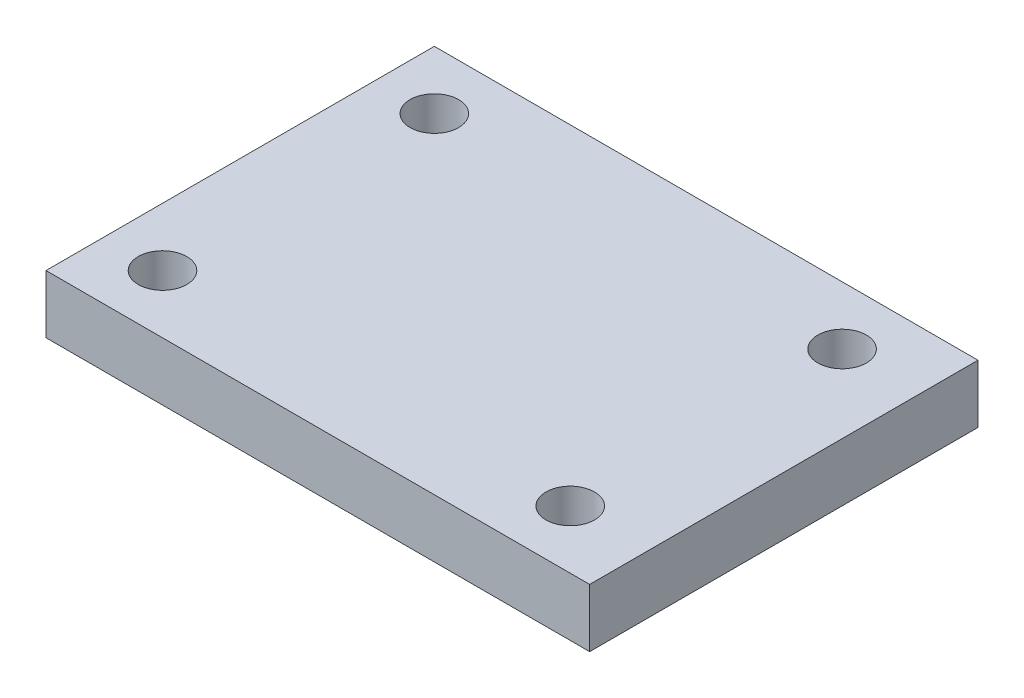
ISO-10303-21;
HEADER;
FILE_DESCRIPTION(('STEP AP214'),'2;1');
FILE_NAME('part.step','',(''),(''),'','','');
FILE_SCHEMA(('AUTOMOTIVE_DESIGN { 1 0 10303 214 1 1 1 1 }'));
ENDSEC;
DATA;
#1=APPLICATION_CONTEXT('core data for automotive mechanical design processes');
#2=APPLICATION_PROTOCOL_DEFINITION('international standard','automotive_design',2000,#1);
#3=PRODUCT_CONTEXT('',#1,'mechanical');
#4=PRODUCT('Part','Part','',(#3));
#5=PRODUCT_RELATED_PRODUCT_CATEGORY('part','',(#4));
#6=PRODUCT_DEFINITION_FORMATION('','',#4);
#7=PRODUCT_DEFINITION_CONTEXT('part definition',#1,'design');
#8=PRODUCT_DEFINITION('design','',#6,#7);
#9=PRODUCT_DEFINITION_SHAPE('','',#8);
#10=(LENGTH_UNIT() NAMED_UNIT(*) SI_UNIT(.MILLI.,.METRE.));
#11=(NAMED_UNIT(*) PLANE_ANGLE_UNIT() SI_UNIT($,.RADIAN.));
#12=(NAMED_UNIT(*) SI_UNIT($,.STERADIAN.) SOLID_ANGLE_UNIT());
#13=UNCERTAINTY_MEASURE_WITH_UNIT(LENGTH_MEASURE(1.E-05),#10,'distance_accuracy_value','');
#14=(GEOMETRIC_REPRESENTATION_CONTEXT(3) GLOBAL_UNCERTAINTY_ASSIGNED_CONTEXT((#13)) GLOBAL_UNIT_ASSIGNED_CONTEXT((#10,
#11,#12)) REPRESENTATION_CONTEXT('',''));
#15=CARTESIAN_POINT('',(0.,0.,0.));
#16=DIRECTION('',(0.,0.,1.));
#17=DIRECTION('',(1.,0.,0.));
#18=AXIS2_PLACEMENT_3D('',#15,#16,#17);
#19=CARTESIAN_POINT('',(14.,3.,-10.));
#20=DIRECTION('',(-1.,0.,0.));
#21=DIRECTION('',(0.,0.,1.));
#22=AXIS2_PLACEMENT_3D('',#19,#20,#21);
#23=PLANE('',#22);
#24=DIRECTION('',(0.,0.,-1.));
#25=VECTOR('',#24,1.);
#26=CARTESIAN_POINT('',(14.,0.,-10.));
#27=LINE('',#26,#25);
#28=CARTESIAN_POINT('',(14.,0.,10.));
#29=VERTEX_POINT('',#28);
#30=CARTESIAN_POINT('',(14.,0.,-10.));
#31=VERTEX_POINT('',#30);
#32=EDGE_CURVE('E105',#29,#31,#27,.T.);
#33=ORIENTED_EDGE('',*,*,#32,.T.);
#34=DIRECTION('',(0.,-1.,0.));
#35=VECTOR('',#34,1.);
#36=CARTESIAN_POINT('',(14.,3.,-10.));
#37=LINE('',#36,#35);
#38=CARTESIAN_POINT('',(14.,3.,-10.));
#39=VERTEX_POINT('',#38);
#40=EDGE_CURVE('E11',#39,#31,#37,.T.);
#41=ORIENTED_EDGE('',*,*,#40,.F.);
#42=DIRECTION('',(0.,0.,-1.));
#43=VECTOR('',#42,1.);
#44=CARTESIAN_POINT('',(14.,3.,-10.));
#45=LINE('',#44,#43);
#46=CARTESIAN_POINT('',(14.,3.,10.));
#47=VERTEX_POINT('',#46);
#48=EDGE_CURVE('E93',#47,#39,#45,.T.);
#49=ORIENTED_EDGE('',*,*,#48,.F.);
#50=DIRECTION('',(0.,-1.,0.));
#51=VECTOR('',#50,1.);
#52=CARTESIAN_POINT('',(14.,3.,10.));
#53=LINE('',#52,#51);
#54=EDGE_CURVE('E101',#47,#29,#53,.T.);
#55=ORIENTED_EDGE('',*,*,#54,.T.);
#56=EDGE_LOOP('',(#33,#41,#49,#55));
#57=FACE_BOUND('',#56,.T.);
#58=ADVANCED_FACE('F42',(#57),#23,.F.);
#59=CARTESIAN_POINT('',(-14.,3.,-10.));
#60=DIRECTION('',(0.,0.,1.));
#61=DIRECTION('',(1.,0.,0.));
#62=AXIS2_PLACEMENT_3D('',#59,#60,#61);
#63=PLANE('',#62);
#64=DIRECTION('',(-1.,0.,0.));
#65=VECTOR('',#64,1.);
#66=CARTESIAN_POINT('',(-14.,0.,-10.));
#67=LINE('',#66,#65);
#68=CARTESIAN_POINT('',(-14.,0.,-10.));
#69=VERTEX_POINT('',#68);
#70=EDGE_CURVE('E97',#31,#69,#67,.T.);
#71=ORIENTED_EDGE('',*,*,#70,.T.);
#72=DIRECTION('',(0.,-1.,0.));
#73=VECTOR('',#72,1.);
#74=CARTESIAN_POINT('',(-14.,3.,-10.));
#75=LINE('',#74,#73);
#76=CARTESIAN_POINT('',(-14.,3.,-10.));
#77=VERTEX_POINT('',#76);
#78=EDGE_CURVE('E50',#77,#69,#75,.T.);
#79=ORIENTED_EDGE('',*,*,#78,.F.);
#80=DIRECTION('',(-1.,0.,0.));
#81=VECTOR('',#80,1.);
#82=CARTESIAN_POINT('',(-14.,3.,-10.));
#83=LINE('',#82,#81);
#84=EDGE_CURVE('E88',#39,#77,#83,.T.);
#85=ORIENTED_EDGE('',*,*,#84,.F.);
#86=ORIENTED_EDGE('',*,*,#40,.T.);
#87=EDGE_LOOP('',(#71,#79,#85,#86));
#88=FACE_BOUND('',#87,.T.);
#89=ADVANCED_FACE('F96',(#88),#63,.F.);
#90=CARTESIAN_POINT('',(-14.,3.,-10.));
#91=DIRECTION('',(1.,0.,0.));
#92=DIRECTION('',(0.,0.,-1.));
#93=AXIS2_PLACEMENT_3D('',#90,#91,#92);
#94=PLANE('',#93);
#95=DIRECTION('',(0.,0.,1.));
#96=VECTOR('',#95,1.);
#97=CARTESIAN_POINT('',(-14.,0.,-10.));
#98=LINE('',#97,#96);
#99=CARTESIAN_POINT('',(-14.,0.,10.));
#100=VERTEX_POINT('',#99);
#101=EDGE_CURVE('E75',#69,#100,#98,.T.);
#102=ORIENTED_EDGE('',*,*,#101,.T.);
#103=DIRECTION('',(0.,-1.,0.));
#104=VECTOR('',#103,1.);
#105=CARTESIAN_POINT('',(-14.,3.,10.));
#106=LINE('',#105,#104);
#107=CARTESIAN_POINT('',(-14.,3.,10.));
#108=VERTEX_POINT('',#107);
#109=EDGE_CURVE('E98',#108,#100,#106,.T.);
#110=ORIENTED_EDGE('',*,*,#109,.F.);
#111=DIRECTION('',(0.,0.,1.));
#112=VECTOR('',#111,1.);
#113=CARTESIAN_POINT('',(-14.,3.,-10.));
#114=LINE('',#113,#112);
#115=EDGE_CURVE('E91',#77,#108,#114,.T.);
#116=ORIENTED_EDGE('',*,*,#115,.F.);
#117=ORIENTED_EDGE('',*,*,#78,.T.);
#118=EDGE_LOOP('',(#102,#110,#116,#117));
#119=FACE_BOUND('',#118,.T.);
#120=ADVANCED_FACE('F99',(#119),#94,.F.);
#121=CARTESIAN_POINT('',(-14.,3.,10.));
#122=DIRECTION('',(0.,0.,-1.));
#123=DIRECTION('',(-1.,0.,0.));
#124=AXIS2_PLACEMENT_3D('',#121,#122,#123);
#125=PLANE('',#124);
#126=DIRECTION('',(1.,0.,0.));
#127=VECTOR('',#126,1.);
#128=CARTESIAN_POINT('',(-14.,0.,10.));
#129=LINE('',#128,#127);
#130=EDGE_CURVE('E81',#100,#29,#129,.T.);
#131=ORIENTED_EDGE('',*,*,#130,.T.);
#132=ORIENTED_EDGE('',*,*,#54,.F.);
#133=DIRECTION('',(1.,0.,0.));
#134=VECTOR('',#133,1.);
#135=CARTESIAN_POINT('',(-14.,3.,10.));
#136=LINE('',#135,#134);
#137=EDGE_CURVE('E58',#108,#47,#136,.T.);
#138=ORIENTED_EDGE('',*,*,#137,.F.);
#139=ORIENTED_EDGE('',*,*,#109,.T.);
#140=EDGE_LOOP('',(#131,#132,#138,#139));
#141=FACE_BOUND('',#140,.T.);
#142=ADVANCED_FACE('F113',(#141),#125,.F.);
#143=CARTESIAN_POINT('',(0.,3.,0.));
#144=DIRECTION('',(0.,1.,0.));
#145=DIRECTION('',(0.,0.,1.));
#146=AXIS2_PLACEMENT_3D('',#143,#144,#145);
#147=PLANE('',#146);
#148=CARTESIAN_POINT('',(-11.,3.,-7.));
#149=DIRECTION('',(0.,1.,0.));
#150=DIRECTION('',(0.,0.,1.));
#151=AXIS2_PLACEMENT_3D('',#148,#149,#150);
#152=CIRCLE('',#151,1.25);
#153=CARTESIAN_POINT('',(-11.,3.,-5.75));
#154=VERTEX_POINT('',#153);
#155=EDGE_CURVE('E139',#154,#154,#152,.T.);
#156=ORIENTED_EDGE('',*,*,#155,.F.);
#157=EDGE_LOOP('',(#156));
#158=FACE_BOUND('',#157,.T.);
#159=CARTESIAN_POINT('',(-11.,3.,7.));
#160=DIRECTION('',(0.,1.,0.));
#161=DIRECTION('',(0.,0.,1.));
#162=AXIS2_PLACEMENT_3D('',#159,#160,#161);
#163=CIRCLE('',#162,1.25);
#164=CARTESIAN_POINT('',(-11.,3.,8.25));
#165=VERTEX_POINT('',#164);
#166=EDGE_CURVE('E133',#165,#165,#163,.T.);
#167=ORIENTED_EDGE('',*,*,#166,.F.);
#168=EDGE_LOOP('',(#167));
#169=FACE_BOUND('',#168,.T.);
#170=CARTESIAN_POINT('',(9.99999999999999,3.,7.));
#171=DIRECTION('',(0.,1.,0.));
#172=DIRECTION('',(0.,0.,1.));
#173=AXIS2_PLACEMENT_3D('',#170,#171,#172);
#174=CIRCLE('',#173,1.25);
#175=CARTESIAN_POINT('',(9.99999999999999,3.,8.25));
#176=VERTEX_POINT('',#175);
#177=EDGE_CURVE('E127',#176,#176,#174,.T.);
#178=ORIENTED_EDGE('',*,*,#177,.F.);
#179=EDGE_LOOP('',(#178));
#180=FACE_BOUND('',#179,.T.);
#181=CARTESIAN_POINT('',(9.99999999999999,3.,-7.));
#182=DIRECTION('',(0.,1.,0.));
#183=DIRECTION('',(0.,0.,1.));
#184=AXIS2_PLACEMENT_3D('',#181,#182,#183);
#185=CIRCLE('',#184,1.25);
#186=CARTESIAN_POINT('',(9.99999999999999,3.,-5.75));
#187=VERTEX_POINT('',#186);
#188=EDGE_CURVE('E121',#187,#187,#185,.T.);
#189=ORIENTED_EDGE('',*,*,#188,.F.);
#190=EDGE_LOOP('',(#189));
#191=FACE_BOUND('',#190,.T.);
#192=ORIENTED_EDGE('',*,*,#48,.T.);
#193=ORIENTED_EDGE('',*,*,#84,.T.);
#194=ORIENTED_EDGE('',*,*,#115,.T.);
#195=ORIENTED_EDGE('',*,*,#137,.T.);
#196=EDGE_LOOP('',(#192,#193,#194,#195));
#197=FACE_BOUND('',#196,.T.);
#198=ADVANCED_FACE('F89',(#158,#169,#180,#191,#197),#147,.T.);
#199=CARTESIAN_POINT('',(0.,0.,0.));
#200=DIRECTION('',(0.,1.,0.));
#201=DIRECTION('',(0.,0.,1.));
#202=AXIS2_PLACEMENT_3D('',#199,#200,#201);
#203=PLANE('',#202);
#204=CARTESIAN_POINT('',(-11.,0.,-7.));
#205=DIRECTION('',(0.,1.,0.));
#206=DIRECTION('',(0.,0.,1.));
#207=AXIS2_PLACEMENT_3D('',#204,#205,#206);
#208=CIRCLE('',#207,1.25);
#209=CARTESIAN_POINT('',(-11.,0.,-5.75));
#210=VERTEX_POINT('',#209);
#211=EDGE_CURVE('E136',#210,#210,#208,.T.);
#212=ORIENTED_EDGE('',*,*,#211,.T.);
#213=EDGE_LOOP('',(#212));
#214=FACE_BOUND('',#213,.T.);
#215=CARTESIAN_POINT('',(-11.,0.,7.));
#216=DIRECTION('',(0.,1.,0.));
#217=DIRECTION('',(0.,0.,1.));
#218=AXIS2_PLACEMENT_3D('',#215,#216,#217);
#219=CIRCLE('',#218,1.25);
#220=CARTESIAN_POINT('',(-11.,0.,8.25));
#221=VERTEX_POINT('',#220);
#222=EDGE_CURVE('E130',#221,#221,#219,.T.);
#223=ORIENTED_EDGE('',*,*,#222,.T.);
#224=EDGE_LOOP('',(#223));
#225=FACE_BOUND('',#224,.T.);
#226=CARTESIAN_POINT('',(9.99999999999999,0.,7.));
#227=DIRECTION('',(0.,1.,0.));
#228=DIRECTION('',(0.,0.,1.));
#229=AXIS2_PLACEMENT_3D('',#226,#227,#228);
#230=CIRCLE('',#229,1.25);
#231=CARTESIAN_POINT('',(9.99999999999999,0.,8.25));
#232=VERTEX_POINT('',#231);
#233=EDGE_CURVE('E124',#232,#232,#230,.T.);
#234=ORIENTED_EDGE('',*,*,#233,.T.);
#235=EDGE_LOOP('',(#234));
#236=FACE_BOUND('',#235,.T.);
#237=CARTESIAN_POINT('',(9.99999999999999,0.,-7.));
#238=DIRECTION('',(0.,1.,0.));
#239=DIRECTION('',(0.,0.,1.));
#240=AXIS2_PLACEMENT_3D('',#237,#238,#239);
#241=CIRCLE('',#240,1.25);
#242=CARTESIAN_POINT('',(9.99999999999999,0.,-5.75));
#243=VERTEX_POINT('',#242);
#244=EDGE_CURVE('E108',#243,#243,#241,.T.);
#245=ORIENTED_EDGE('',*,*,#244,.T.);
#246=EDGE_LOOP('',(#245));
#247=FACE_BOUND('',#246,.T.);
#248=ORIENTED_EDGE('',*,*,#32,.F.);
#249=ORIENTED_EDGE('',*,*,#130,.F.);
#250=ORIENTED_EDGE('',*,*,#101,.F.);
#251=ORIENTED_EDGE('',*,*,#70,.F.);
#252=EDGE_LOOP('',(#248,#249,#250,#251));
#253=FACE_BOUND('',#252,.T.);
#254=ADVANCED_FACE('F116',(#214,#225,#236,#247,#253),#203,.F.);
#255=CARTESIAN_POINT('',(9.99999999999999,3.,-7.));
#256=DIRECTION('',(0.,1.,0.));
#257=DIRECTION('',(0.,0.,1.));
#258=AXIS2_PLACEMENT_3D('',#255,#256,#257);
#259=CYLINDRICAL_SURFACE('',#258,1.25);
#260=ORIENTED_EDGE('',*,*,#244,.F.);
#261=EDGE_LOOP('',(#260));
#262=FACE_BOUND('',#261,.T.);
#263=ORIENTED_EDGE('',*,*,#188,.T.);
#264=EDGE_LOOP('',(#263));
#265=FACE_BOUND('',#264,.T.);
#266=ADVANCED_FACE('F154',(#262,#265),#259,.F.);
#267=CARTESIAN_POINT('',(9.99999999999999,3.,7.));
#268=DIRECTION('',(0.,1.,0.));
#269=DIRECTION('',(0.,0.,1.));
#270=AXIS2_PLACEMENT_3D('',#267,#268,#269);
#271=CYLINDRICAL_SURFACE('',#270,1.25);
#272=ORIENTED_EDGE('',*,*,#233,.F.);
#273=EDGE_LOOP('',(#272));
#274=FACE_BOUND('',#273,.T.);
#275=ORIENTED_EDGE('',*,*,#177,.T.);
#276=EDGE_LOOP('',(#275));
#277=FACE_BOUND('',#276,.T.);
#278=ADVANCED_FACE('F156',(#274,#277),#271,.F.);
#279=CARTESIAN_POINT('',(-11.,3.,7.));
#280=DIRECTION('',(0.,1.,0.));
#281=DIRECTION('',(0.,0.,1.));
#282=AXIS2_PLACEMENT_3D('',#279,#280,#281);
#283=CYLINDRICAL_SURFACE('',#282,1.25);
#284=ORIENTED_EDGE('',*,*,#222,.F.);
#285=EDGE_LOOP('',(#284));
#286=FACE_BOUND('',#285,.T.);
#287=ORIENTED_EDGE('',*,*,#166,.T.);
#288=EDGE_LOOP('',(#287));
#289=FACE_BOUND('',#288,.T.);
#290=ADVANCED_FACE('F163',(#286,#289),#283,.F.);
#291=CARTESIAN_POINT('',(-11.,3.,-7.));
#292=DIRECTION('',(0.,1.,0.));
#293=DIRECTION('',(0.,0.,1.));
#294=AXIS2_PLACEMENT_3D('',#291,#292,#293);
#295=CYLINDRICAL_SURFACE('',#294,1.25);
#296=ORIENTED_EDGE('',*,*,#211,.F.);
#297=EDGE_LOOP('',(#296));
#298=FACE_BOUND('',#297,.T.);
#299=ORIENTED_EDGE('',*,*,#155,.T.);
#300=EDGE_LOOP('',(#299));
#301=FACE_BOUND('',#300,.T.);
#302=ADVANCED_FACE('F143',(#298,#301),#295,.F.);
#303=CLOSED_SHELL('',(#58,#89,#120,#142,#198,#254,#266,#278,#290,#302));
#304=MANIFOLD_SOLID_BREP('B2',#303);
#305=ADVANCED_BREP_SHAPE_REPRESENTATION('',(#18,#304),#14);
#306=SHAPE_DEFINITION_REPRESENTATION(#9,#305);
ENDSEC;
END-ISO-10303-21;
